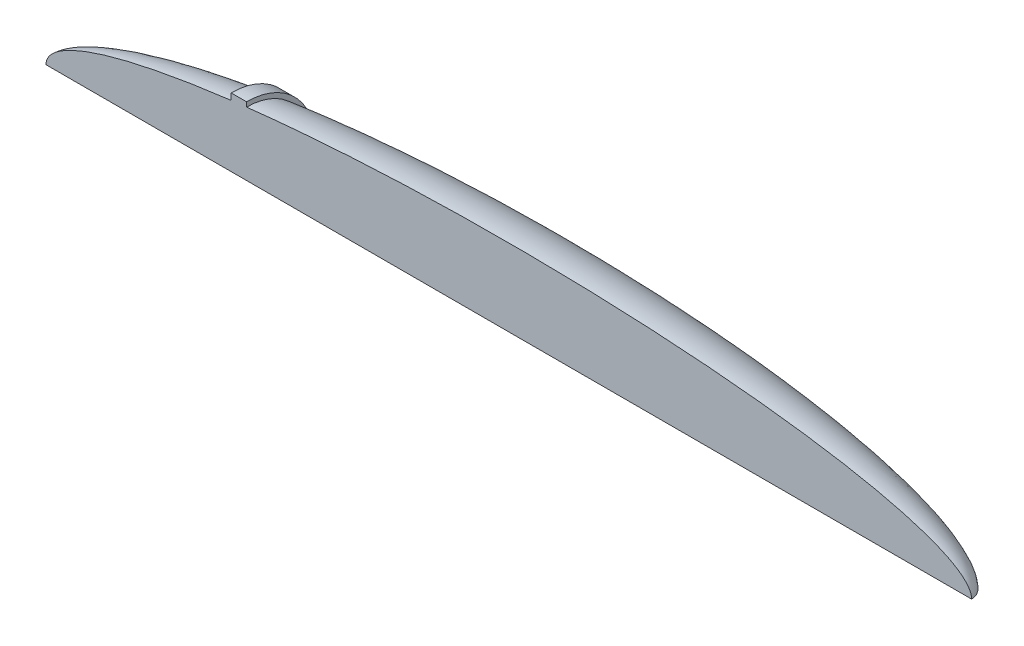
ISO-10303-21;
HEADER;
FILE_DESCRIPTION(('STEP AP214'),'2;1');
FILE_NAME('part.step','',(''),(''),'','','');
FILE_SCHEMA(('AUTOMOTIVE_DESIGN { 1 0 10303 214 1 1 1 1 }'));
ENDSEC;
DATA;
#1=APPLICATION_CONTEXT('core data for automotive mechanical design processes');
#2=APPLICATION_PROTOCOL_DEFINITION('international standard','automotive_design',2000,#1);
#3=PRODUCT_CONTEXT('',#1,'mechanical');
#4=PRODUCT('Part','Part','',(#3));
#5=PRODUCT_RELATED_PRODUCT_CATEGORY('part','',(#4));
#6=PRODUCT_DEFINITION_FORMATION('','',#4);
#7=PRODUCT_DEFINITION_CONTEXT('part definition',#1,'design');
#8=PRODUCT_DEFINITION('design','',#6,#7);
#9=PRODUCT_DEFINITION_SHAPE('','',#8);
#10=(LENGTH_UNIT() NAMED_UNIT(*) SI_UNIT(.MILLI.,.METRE.));
#11=(NAMED_UNIT(*) PLANE_ANGLE_UNIT() SI_UNIT($,.RADIAN.));
#12=(NAMED_UNIT(*) SI_UNIT($,.STERADIAN.) SOLID_ANGLE_UNIT());
#13=UNCERTAINTY_MEASURE_WITH_UNIT(LENGTH_MEASURE(1.E-05),#10,'distance_accuracy_value','');
#14=(GEOMETRIC_REPRESENTATION_CONTEXT(3) GLOBAL_UNCERTAINTY_ASSIGNED_CONTEXT((#13)) GLOBAL_UNIT_ASSIGNED_CONTEXT((#10,
#11,#12)) REPRESENTATION_CONTEXT('',''));
#15=CARTESIAN_POINT('',(0.,0.,0.));
#16=DIRECTION('',(0.,0.,1.));
#17=DIRECTION('',(1.,0.,0.));
#18=AXIS2_PLACEMENT_3D('',#15,#16,#17);
#19=CARTESIAN_POINT('',(0.,0.,0.));
#20=DIRECTION('',(0.,0.,1.));
#21=DIRECTION('',(1.,0.,0.));
#22=AXIS2_PLACEMENT_3D('',#19,#20,#21);
#23=ELLIPSE('',#22,6000.,1000.);
#24=TRIMMED_CURVE('',#23,(PARAMETER_VALUE(0.)),(PARAMETER_VALUE(3.14159265358979)),.T.,.PARAMETER.);
#25=CARTESIAN_POINT('',(-1000.,0.,0.));
#26=DIRECTION('',(-1.,0.,0.));
#27=AXIS1_PLACEMENT('',#25,#26);
#28=SURFACE_OF_REVOLUTION('',#24,#27);
#29=CARTESIAN_POINT('',(0.,0.,0.));
#30=DIRECTION('',(0.,1.,0.));
#31=DIRECTION('',(1.,0.,0.));
#32=AXIS2_PLACEMENT_3D('',#29,#30,#31);
#33=ELLIPSE('',#32,6000.,1000.);
#34=CARTESIAN_POINT('',(-3600.,0.,-800.));
#35=VERTEX_POINT('',#34);
#36=CARTESIAN_POINT('',(-6000.,0.,0.));
#37=VERTEX_POINT('',#36);
#38=EDGE_CURVE('E99',#35,#37,#33,.T.);
#39=ORIENTED_EDGE('',*,*,#38,.T.);
#40=CARTESIAN_POINT('',(-3600.,800.,2.79318507107451E-12));
#41=VERTEX_POINT('',#40);
#42=EDGE_CURVE('E111',#41,#37,#23,.T.);
#43=ORIENTED_EDGE('',*,*,#42,.F.);
#44=CARTESIAN_POINT('',(-3600.,0.,0.));
#45=DIRECTION('',(-1.,0.,0.));
#46=DIRECTION('',(0.,0.,1.));
#47=AXIS2_PLACEMENT_3D('',#44,#45,#46);
#48=CIRCLE('',#47,800.);
#49=EDGE_CURVE('E52',#41,#35,#48,.T.);
#50=ORIENTED_EDGE('',*,*,#49,.T.);
#51=EDGE_LOOP('',(#39,#43,#50));
#52=FACE_BOUND('',#51,.T.);
#53=ADVANCED_FACE('F36',(#52),#28,.T.);
#54=CARTESIAN_POINT('',(0.,0.,0.));
#55=DIRECTION('',(0.,0.,1.));
#56=DIRECTION('',(1.,0.,0.));
#57=AXIS2_PLACEMENT_3D('',#54,#55,#56);
#58=ELLIPSE('',#57,6000.,1000.);
#59=TRIMMED_CURVE('',#58,(PARAMETER_VALUE(0.)),(PARAMETER_VALUE(3.14159265358979)),.T.,.PARAMETER.);
#60=CARTESIAN_POINT('',(-1000.,0.,0.));
#61=DIRECTION('',(-1.,0.,0.));
#62=AXIS1_PLACEMENT('',#60,#61);
#63=SURFACE_OF_REVOLUTION('',#59,#62);
#64=CARTESIAN_POINT('',(-3400.,0.,0.));
#65=DIRECTION('',(-1.,0.,0.));
#66=DIRECTION('',(0.,0.,1.));
#67=AXIS2_PLACEMENT_3D('',#64,#65,#66);
#68=CIRCLE('',#67,823.947139620552);
#69=CARTESIAN_POINT('',(-3400.,823.947139620552,2.87679606217833E-12));
#70=VERTEX_POINT('',#69);
#71=CARTESIAN_POINT('',(-3400.,0.,-823.947139620552));
#72=VERTEX_POINT('',#71);
#73=EDGE_CURVE('E11',#70,#72,#68,.T.);
#74=ORIENTED_EDGE('',*,*,#73,.F.);
#75=CARTESIAN_POINT('',(6000.,0.,0.));
#76=VERTEX_POINT('',#75);
#77=EDGE_CURVE('E96',#76,#70,#58,.T.);
#78=ORIENTED_EDGE('',*,*,#77,.F.);
#79=CARTESIAN_POINT('',(0.,0.,0.));
#80=DIRECTION('',(0.,1.,0.));
#81=DIRECTION('',(1.,0.,0.));
#82=AXIS2_PLACEMENT_3D('',#79,#80,#81);
#83=ELLIPSE('',#82,6000.,1000.);
#84=EDGE_CURVE('E95',#76,#72,#83,.T.);
#85=ORIENTED_EDGE('',*,*,#84,.T.);
#86=EDGE_LOOP('',(#74,#78,#85));
#87=FACE_BOUND('',#86,.T.);
#88=ADVANCED_FACE('F38',(#87),#63,.T.);
#89=CARTESIAN_POINT('',(-3400.,883.947139620552,3.08628494250892E-12));
#90=DIRECTION('',(-1.,0.,0.));
#91=DIRECTION('',(0.,0.,1.));
#92=AXIS2_PLACEMENT_3D('',#89,#90,#91);
#93=PLANE('',#92);
#94=CARTESIAN_POINT('',(-3400.,0.,0.));
#95=DIRECTION('',(-1.,0.,0.));
#96=DIRECTION('',(0.,0.,1.));
#97=AXIS2_PLACEMENT_3D('',#94,#95,#96);
#98=CIRCLE('',#97,883.947139620552);
#99=CARTESIAN_POINT('',(-3400.,883.947139620552,3.08628494250892E-12));
#100=VERTEX_POINT('',#99);
#101=CARTESIAN_POINT('',(-3400.,0.,-883.947139620552));
#102=VERTEX_POINT('',#101);
#103=EDGE_CURVE('E45',#100,#102,#98,.T.);
#104=ORIENTED_EDGE('',*,*,#103,.F.);
#105=DIRECTION('',(0.,1.,0.));
#106=VECTOR('',#105,1.);
#107=CARTESIAN_POINT('',(-3400.,883.947139620552,3.08628494250892E-12));
#108=LINE('',#107,#106);
#109=EDGE_CURVE('E91',#70,#100,#108,.T.);
#110=ORIENTED_EDGE('',*,*,#109,.F.);
#111=ORIENTED_EDGE('',*,*,#73,.T.);
#112=DIRECTION('',(0.,0.,-1.));
#113=VECTOR('',#112,1.);
#114=CARTESIAN_POINT('',(-3400.,0.,-883.947139620552));
#115=LINE('',#114,#113);
#116=EDGE_CURVE('E88',#72,#102,#115,.T.);
#117=ORIENTED_EDGE('',*,*,#116,.T.);
#118=EDGE_LOOP('',(#104,#110,#111,#117));
#119=FACE_BOUND('',#118,.T.);
#120=ADVANCED_FACE('F86',(#119),#93,.F.);
#121=CARTESIAN_POINT('',(-1000.,0.,0.));
#122=DIRECTION('',(-1.,0.,0.));
#123=DIRECTION('',(0.,0.,1.));
#124=AXIS2_PLACEMENT_3D('',#121,#122,#123);
#125=CYLINDRICAL_SURFACE('',#124,883.947139620552);
#126=CARTESIAN_POINT('',(-3600.,0.,0.));
#127=DIRECTION('',(-1.,0.,0.));
#128=DIRECTION('',(0.,0.,1.));
#129=AXIS2_PLACEMENT_3D('',#126,#127,#128);
#130=CIRCLE('',#129,883.947139620552);
#131=CARTESIAN_POINT('',(-3600.,883.947139620552,3.08628494250892E-12));
#132=VERTEX_POINT('',#131);
#133=CARTESIAN_POINT('',(-3600.,0.,-883.947139620552));
#134=VERTEX_POINT('',#133);
#135=EDGE_CURVE('E60',#132,#134,#130,.T.);
#136=ORIENTED_EDGE('',*,*,#135,.F.);
#137=DIRECTION('',(-1.,0.,0.));
#138=VECTOR('',#137,1.);
#139=CARTESIAN_POINT('',(-3400.,883.947139620552,3.08628494250892E-12));
#140=LINE('',#139,#138);
#141=EDGE_CURVE('E179',#100,#132,#140,.T.);
#142=ORIENTED_EDGE('',*,*,#141,.F.);
#143=ORIENTED_EDGE('',*,*,#103,.T.);
#144=DIRECTION('',(-1.,0.,0.));
#145=VECTOR('',#144,1.);
#146=CARTESIAN_POINT('',(-3400.,0.,-883.947139620552));
#147=LINE('',#146,#145);
#148=EDGE_CURVE('E104',#102,#134,#147,.T.);
#149=ORIENTED_EDGE('',*,*,#148,.T.);
#150=EDGE_LOOP('',(#136,#142,#143,#149));
#151=FACE_BOUND('',#150,.T.);
#152=ADVANCED_FACE('F126',(#151),#125,.T.);
#153=CARTESIAN_POINT('',(-3600.,883.947139620552,3.08628494250892E-12));
#154=DIRECTION('',(1.,0.,0.));
#155=DIRECTION('',(0.,0.,-1.));
#156=AXIS2_PLACEMENT_3D('',#153,#154,#155);
#157=PLANE('',#156);
#158=DIRECTION('',(0.,-1.,0.));
#159=VECTOR('',#158,1.);
#160=CARTESIAN_POINT('',(-3600.,883.947139620552,3.08628494250892E-12));
#161=LINE('',#160,#159);
#162=EDGE_CURVE('E176',#132,#41,#161,.T.);
#163=ORIENTED_EDGE('',*,*,#162,.F.);
#164=ORIENTED_EDGE('',*,*,#135,.T.);
#165=DIRECTION('',(0.,0.,1.));
#166=VECTOR('',#165,1.);
#167=CARTESIAN_POINT('',(-3600.,0.,-883.947139620552));
#168=LINE('',#167,#166);
#169=EDGE_CURVE('E106',#134,#35,#168,.T.);
#170=ORIENTED_EDGE('',*,*,#169,.T.);
#171=ORIENTED_EDGE('',*,*,#49,.F.);
#172=EDGE_LOOP('',(#163,#164,#170,#171));
#173=FACE_BOUND('',#172,.T.);
#174=ADVANCED_FACE('F123',(#173),#157,.F.);
#175=CARTESIAN_POINT('',(0.,0.,0.));
#176=DIRECTION('',(0.,0.,1.));
#177=DIRECTION('',(0.,-1.,0.));
#178=AXIS2_PLACEMENT_3D('',#175,#176,#177);
#179=PLANE('',#178);
#180=ORIENTED_EDGE('',*,*,#42,.T.);
#181=DIRECTION('',(1.,0.,0.));
#182=VECTOR('',#181,1.);
#183=CARTESIAN_POINT('',(-6000.,0.,0.));
#184=LINE('',#183,#182);
#185=EDGE_CURVE('E115',#37,#76,#184,.T.);
#186=ORIENTED_EDGE('',*,*,#185,.T.);
#187=ORIENTED_EDGE('',*,*,#77,.T.);
#188=ORIENTED_EDGE('',*,*,#109,.T.);
#189=ORIENTED_EDGE('',*,*,#141,.T.);
#190=ORIENTED_EDGE('',*,*,#162,.T.);
#191=EDGE_LOOP('',(#180,#186,#187,#188,#189,#190));
#192=FACE_BOUND('',#191,.T.);
#193=ADVANCED_FACE('F121',(#192),#179,.T.);
#194=CARTESIAN_POINT('',(0.,0.,0.));
#195=DIRECTION('',(0.,1.,0.));
#196=DIRECTION('',(0.,0.,1.));
#197=AXIS2_PLACEMENT_3D('',#194,#195,#196);
#198=PLANE('',#197);
#199=ORIENTED_EDGE('',*,*,#38,.F.);
#200=ORIENTED_EDGE('',*,*,#169,.F.);
#201=ORIENTED_EDGE('',*,*,#148,.F.);
#202=ORIENTED_EDGE('',*,*,#116,.F.);
#203=ORIENTED_EDGE('',*,*,#84,.F.);
#204=ORIENTED_EDGE('',*,*,#185,.F.);
#205=EDGE_LOOP('',(#199,#200,#201,#202,#203,#204));
#206=FACE_BOUND('',#205,.T.);
#207=ADVANCED_FACE('F102',(#206),#198,.F.);
#208=CLOSED_SHELL('',(#53,#88,#120,#152,#174,#193,#207));
#209=MANIFOLD_SOLID_BREP('B2',#208);
#210=ADVANCED_BREP_SHAPE_REPRESENTATION('',(#18,#209),#14);
#211=SHAPE_DEFINITION_REPRESENTATION(#9,#210);
ENDSEC;
END-ISO-10303-21;
